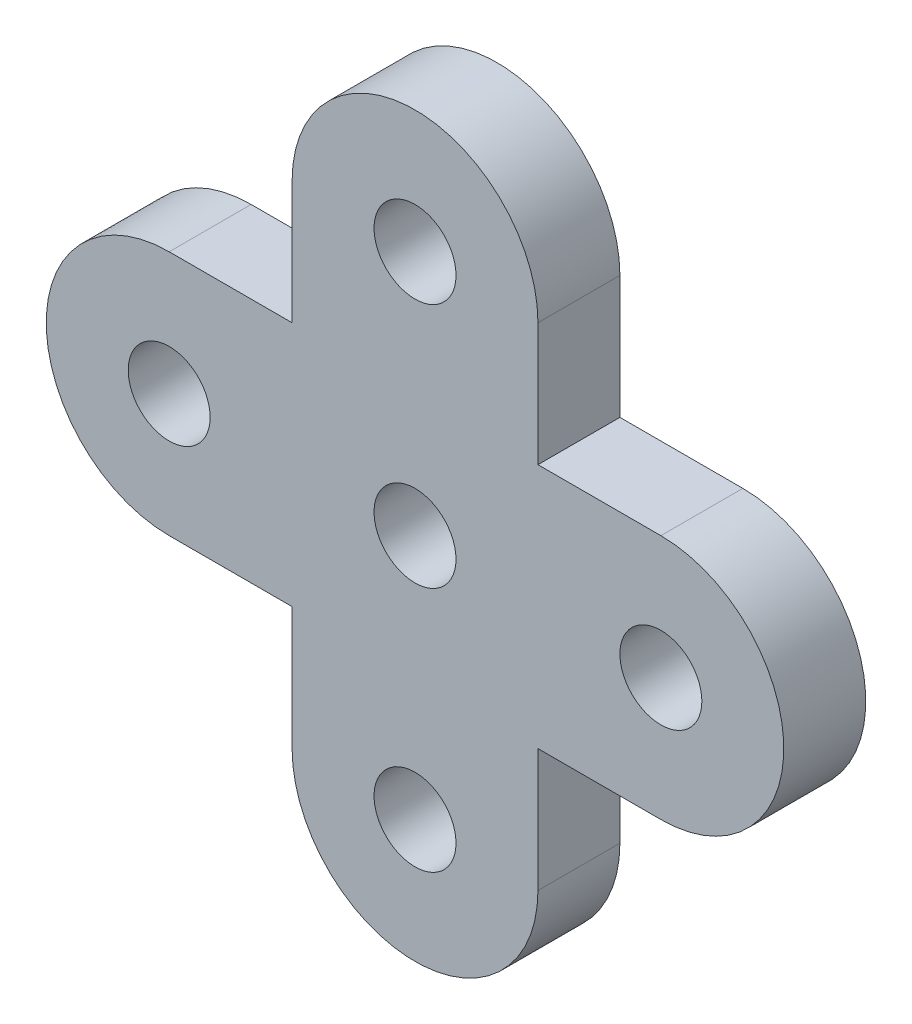
ISO-10303-21;
HEADER;
FILE_DESCRIPTION(('STEP AP214'),'2;1');
FILE_NAME('part.step','',(''),(''),'','','');
FILE_SCHEMA(('AUTOMOTIVE_DESIGN { 1 0 10303 214 1 1 1 1 }'));
ENDSEC;
DATA;
#1=APPLICATION_CONTEXT('core data for automotive mechanical design processes');
#2=APPLICATION_PROTOCOL_DEFINITION('international standard','automotive_design',2000,#1);
#3=PRODUCT_CONTEXT('',#1,'mechanical');
#4=PRODUCT('Part','Part','',(#3));
#5=PRODUCT_RELATED_PRODUCT_CATEGORY('part','',(#4));
#6=PRODUCT_DEFINITION_FORMATION('','',#4);
#7=PRODUCT_DEFINITION_CONTEXT('part definition',#1,'design');
#8=PRODUCT_DEFINITION('design','',#6,#7);
#9=PRODUCT_DEFINITION_SHAPE('','',#8);
#10=(LENGTH_UNIT() NAMED_UNIT(*) SI_UNIT(.MILLI.,.METRE.));
#11=(NAMED_UNIT(*) PLANE_ANGLE_UNIT() SI_UNIT($,.RADIAN.));
#12=(NAMED_UNIT(*) SI_UNIT($,.STERADIAN.) SOLID_ANGLE_UNIT());
#13=UNCERTAINTY_MEASURE_WITH_UNIT(LENGTH_MEASURE(1.E-05),#10,'distance_accuracy_value','');
#14=(GEOMETRIC_REPRESENTATION_CONTEXT(3) GLOBAL_UNCERTAINTY_ASSIGNED_CONTEXT((#13)) GLOBAL_UNIT_ASSIGNED_CONTEXT((#10,
#11,#12)) REPRESENTATION_CONTEXT('',''));
#15=CARTESIAN_POINT('',(0.,0.,0.));
#16=DIRECTION('',(0.,0.,1.));
#17=DIRECTION('',(1.,0.,0.));
#18=AXIS2_PLACEMENT_3D('',#15,#16,#17);
#19=CARTESIAN_POINT('',(208.7507761496,152.428489513,3.));
#20=DIRECTION('',(0.,0.,1.));
#21=DIRECTION('',(1.,0.,0.));
#22=AXIS2_PLACEMENT_3D('',#19,#20,#21);
#23=PLANE('',#22);
#24=CARTESIAN_POINT('',(199.7507761496,161.428489513,3.));
#25=DIRECTION('',(0.,0.,1.));
#26=DIRECTION('',(1.,0.,0.));
#27=AXIS2_PLACEMENT_3D('',#24,#25,#26);
#28=CIRCLE('',#27,1.5);
#29=CARTESIAN_POINT('',(201.2507761496,161.428489513,3.));
#30=VERTEX_POINT('',#29);
#31=EDGE_CURVE('E296',#30,#30,#28,.T.);
#32=ORIENTED_EDGE('',*,*,#31,.F.);
#33=EDGE_LOOP('',(#32));
#34=FACE_BOUND('',#33,.T.);
#35=CARTESIAN_POINT('',(208.7507761496,161.428489513,3.));
#36=DIRECTION('',(0.,0.,1.));
#37=DIRECTION('',(1.,0.,0.));
#38=AXIS2_PLACEMENT_3D('',#35,#36,#37);
#39=CIRCLE('',#38,1.5);
#40=CARTESIAN_POINT('',(210.2507761496,161.428489513,3.));
#41=VERTEX_POINT('',#40);
#42=EDGE_CURVE('E308',#41,#41,#39,.T.);
#43=ORIENTED_EDGE('',*,*,#42,.F.);
#44=EDGE_LOOP('',(#43));
#45=FACE_BOUND('',#44,.T.);
#46=CARTESIAN_POINT('',(208.7507761496,152.428489513,3.));
#47=DIRECTION('',(0.,0.,1.));
#48=DIRECTION('',(1.,0.,0.));
#49=AXIS2_PLACEMENT_3D('',#46,#47,#48);
#50=CIRCLE('',#49,4.5);
#51=CARTESIAN_POINT('',(204.2507761496,152.428489513,3.));
#52=VERTEX_POINT('',#51);
#53=CARTESIAN_POINT('',(213.2507761496,152.428489513,3.));
#54=VERTEX_POINT('',#53);
#55=EDGE_CURVE('E177',#52,#54,#50,.T.);
#56=ORIENTED_EDGE('',*,*,#55,.T.);
#57=DIRECTION('',(0.,1.,0.));
#58=VECTOR('',#57,1.);
#59=CARTESIAN_POINT('',(213.2507761496,152.428489513,3.));
#60=LINE('',#59,#58);
#61=CARTESIAN_POINT('',(213.2507761496,156.928489513,3.));
#62=VERTEX_POINT('',#61);
#63=EDGE_CURVE('E105',#54,#62,#60,.T.);
#64=ORIENTED_EDGE('',*,*,#63,.T.);
#65=DIRECTION('',(1.,0.,0.));
#66=VECTOR('',#65,1.);
#67=CARTESIAN_POINT('',(213.2507761496,156.928489513,3.));
#68=LINE('',#67,#66);
#69=CARTESIAN_POINT('',(217.7507761496,156.928489513,3.));
#70=VERTEX_POINT('',#69);
#71=EDGE_CURVE('E204',#62,#70,#68,.T.);
#72=ORIENTED_EDGE('',*,*,#71,.T.);
#73=CARTESIAN_POINT('',(217.7507761496,161.428489513,3.));
#74=DIRECTION('',(0.,0.,1.));
#75=DIRECTION('',(1.,0.,0.));
#76=AXIS2_PLACEMENT_3D('',#73,#74,#75);
#77=CIRCLE('',#76,4.5);
#78=CARTESIAN_POINT('',(217.7507761496,165.928489513,3.));
#79=VERTEX_POINT('',#78);
#80=EDGE_CURVE('E223',#70,#79,#77,.T.);
#81=ORIENTED_EDGE('',*,*,#80,.T.);
#82=DIRECTION('',(-1.,0.,0.));
#83=VECTOR('',#82,1.);
#84=CARTESIAN_POINT('',(217.7507761496,165.928489513,3.));
#85=LINE('',#84,#83);
#86=CARTESIAN_POINT('',(213.2507761496,165.928489513,3.));
#87=VERTEX_POINT('',#86);
#88=EDGE_CURVE('E220',#79,#87,#85,.T.);
#89=ORIENTED_EDGE('',*,*,#88,.T.);
#90=DIRECTION('',(0.,1.,0.));
#91=VECTOR('',#90,1.);
#92=CARTESIAN_POINT('',(213.2507761496,165.928489513,3.));
#93=LINE('',#92,#91);
#94=CARTESIAN_POINT('',(213.2507761496,170.428489513,3.));
#95=VERTEX_POINT('',#94);
#96=EDGE_CURVE('E222',#87,#95,#93,.T.);
#97=ORIENTED_EDGE('',*,*,#96,.T.);
#98=CARTESIAN_POINT('',(208.7507761496,170.428489513,3.));
#99=DIRECTION('',(0.,0.,1.));
#100=DIRECTION('',(1.,0.,0.));
#101=AXIS2_PLACEMENT_3D('',#98,#99,#100);
#102=CIRCLE('',#101,4.5);
#103=CARTESIAN_POINT('',(204.2507761496,170.428489513,3.));
#104=VERTEX_POINT('',#103);
#105=EDGE_CURVE('E225',#95,#104,#102,.T.);
#106=ORIENTED_EDGE('',*,*,#105,.T.);
#107=DIRECTION('',(0.,-1.,0.));
#108=VECTOR('',#107,1.);
#109=CARTESIAN_POINT('',(204.2507761496,170.428489513,3.));
#110=LINE('',#109,#108);
#111=CARTESIAN_POINT('',(204.2507761496,165.928489513,3.));
#112=VERTEX_POINT('',#111);
#113=EDGE_CURVE('E231',#104,#112,#110,.T.);
#114=ORIENTED_EDGE('',*,*,#113,.T.);
#115=DIRECTION('',(-1.,0.,0.));
#116=VECTOR('',#115,1.);
#117=CARTESIAN_POINT('',(204.2507761496,165.928489513,3.));
#118=LINE('',#117,#116);
#119=CARTESIAN_POINT('',(199.7507761496,165.928489513,3.));
#120=VERTEX_POINT('',#119);
#121=EDGE_CURVE('E136',#112,#120,#118,.T.);
#122=ORIENTED_EDGE('',*,*,#121,.T.);
#123=CARTESIAN_POINT('',(199.7507761496,161.428489513,3.));
#124=DIRECTION('',(0.,0.,1.));
#125=DIRECTION('',(1.,0.,0.));
#126=AXIS2_PLACEMENT_3D('',#123,#124,#125);
#127=CIRCLE('',#126,4.5);
#128=CARTESIAN_POINT('',(199.7507761496,156.928489513,3.));
#129=VERTEX_POINT('',#128);
#130=EDGE_CURVE('E130',#120,#129,#127,.T.);
#131=ORIENTED_EDGE('',*,*,#130,.T.);
#132=DIRECTION('',(1.,0.,0.));
#133=VECTOR('',#132,1.);
#134=CARTESIAN_POINT('',(199.7507761496,156.928489513,3.));
#135=LINE('',#134,#133);
#136=CARTESIAN_POINT('',(204.2507761496,156.928489513,3.));
#137=VERTEX_POINT('',#136);
#138=EDGE_CURVE('E134',#129,#137,#135,.T.);
#139=ORIENTED_EDGE('',*,*,#138,.T.);
#140=DIRECTION('',(0.,-1.,0.));
#141=VECTOR('',#140,1.);
#142=CARTESIAN_POINT('',(204.2507761496,156.928489513,3.));
#143=LINE('',#142,#141);
#144=EDGE_CURVE('E50',#137,#52,#143,.T.);
#145=ORIENTED_EDGE('',*,*,#144,.T.);
#146=EDGE_LOOP('',(#56,#64,#72,#81,#89,#97,#106,#114,#122,#131,#139,#145));
#147=FACE_BOUND('',#146,.T.);
#148=CARTESIAN_POINT('',(208.7507761496,152.428489513,3.));
#149=DIRECTION('',(0.,0.,1.));
#150=DIRECTION('',(1.,0.,0.));
#151=AXIS2_PLACEMENT_3D('',#148,#149,#150);
#152=CIRCLE('',#151,1.5);
#153=CARTESIAN_POINT('',(210.2507761496,152.428489513,3.));
#154=VERTEX_POINT('',#153);
#155=EDGE_CURVE('E158',#154,#154,#152,.T.);
#156=ORIENTED_EDGE('',*,*,#155,.F.);
#157=EDGE_LOOP('',(#156));
#158=FACE_BOUND('',#157,.T.);
#159=CARTESIAN_POINT('',(208.7507761496,170.428489513,3.));
#160=DIRECTION('',(0.,0.,1.));
#161=DIRECTION('',(1.,0.,0.));
#162=AXIS2_PLACEMENT_3D('',#159,#160,#161);
#163=CIRCLE('',#162,1.5);
#164=CARTESIAN_POINT('',(210.2507761496,170.428489513,3.));
#165=VERTEX_POINT('',#164);
#166=EDGE_CURVE('E302',#165,#165,#163,.T.);
#167=ORIENTED_EDGE('',*,*,#166,.F.);
#168=EDGE_LOOP('',(#167));
#169=FACE_BOUND('',#168,.T.);
#170=CARTESIAN_POINT('',(217.7507761496,161.428489513,3.));
#171=DIRECTION('',(0.,0.,1.));
#172=DIRECTION('',(1.,0.,0.));
#173=AXIS2_PLACEMENT_3D('',#170,#171,#172);
#174=CIRCLE('',#173,1.5);
#175=CARTESIAN_POINT('',(219.2507761496,161.428489513,3.));
#176=VERTEX_POINT('',#175);
#177=EDGE_CURVE('E287',#176,#176,#174,.T.);
#178=ORIENTED_EDGE('',*,*,#177,.F.);
#179=EDGE_LOOP('',(#178));
#180=FACE_BOUND('',#179,.T.);
#181=ADVANCED_FACE('F33',(#34,#45,#147,#158,#169,#180),#23,.T.);
#182=CARTESIAN_POINT('',(208.7507761496,152.428489513,0.));
#183=DIRECTION('',(0.,0.,1.));
#184=DIRECTION('',(1.,0.,0.));
#185=AXIS2_PLACEMENT_3D('',#182,#183,#184);
#186=PLANE('',#185);
#187=CARTESIAN_POINT('',(199.7507761496,161.428489513,0.));
#188=DIRECTION('',(0.,0.,1.));
#189=DIRECTION('',(1.,0.,0.));
#190=AXIS2_PLACEMENT_3D('',#187,#188,#189);
#191=CIRCLE('',#190,1.5);
#192=CARTESIAN_POINT('',(201.2507761496,161.428489513,0.));
#193=VERTEX_POINT('',#192);
#194=EDGE_CURVE('E293',#193,#193,#191,.T.);
#195=ORIENTED_EDGE('',*,*,#194,.T.);
#196=EDGE_LOOP('',(#195));
#197=FACE_BOUND('',#196,.T.);
#198=CARTESIAN_POINT('',(208.7507761496,161.428489513,0.));
#199=DIRECTION('',(0.,0.,1.));
#200=DIRECTION('',(1.,0.,0.));
#201=AXIS2_PLACEMENT_3D('',#198,#199,#200);
#202=CIRCLE('',#201,1.5);
#203=CARTESIAN_POINT('',(210.2507761496,161.428489513,0.));
#204=VERTEX_POINT('',#203);
#205=EDGE_CURVE('E305',#204,#204,#202,.T.);
#206=ORIENTED_EDGE('',*,*,#205,.T.);
#207=EDGE_LOOP('',(#206));
#208=FACE_BOUND('',#207,.T.);
#209=CARTESIAN_POINT('',(208.7507761496,152.428489513,0.));
#210=DIRECTION('',(0.,0.,1.));
#211=DIRECTION('',(1.,0.,0.));
#212=AXIS2_PLACEMENT_3D('',#209,#210,#211);
#213=CIRCLE('',#212,4.5);
#214=CARTESIAN_POINT('',(204.2507761496,152.428489513,0.));
#215=VERTEX_POINT('',#214);
#216=CARTESIAN_POINT('',(213.2507761496,152.428489513,0.));
#217=VERTEX_POINT('',#216);
#218=EDGE_CURVE('E154',#215,#217,#213,.T.);
#219=ORIENTED_EDGE('',*,*,#218,.F.);
#220=DIRECTION('',(0.,-1.,0.));
#221=VECTOR('',#220,1.);
#222=CARTESIAN_POINT('',(204.2507761496,156.928489513,0.));
#223=LINE('',#222,#221);
#224=CARTESIAN_POINT('',(204.2507761496,156.928489513,0.));
#225=VERTEX_POINT('',#224);
#226=EDGE_CURVE('E97',#225,#215,#223,.T.);
#227=ORIENTED_EDGE('',*,*,#226,.F.);
#228=DIRECTION('',(1.,0.,0.));
#229=VECTOR('',#228,1.);
#230=CARTESIAN_POINT('',(199.7507761496,156.928489513,0.));
#231=LINE('',#230,#229);
#232=CARTESIAN_POINT('',(199.7507761496,156.928489513,0.));
#233=VERTEX_POINT('',#232);
#234=EDGE_CURVE('E91',#233,#225,#231,.T.);
#235=ORIENTED_EDGE('',*,*,#234,.F.);
#236=CARTESIAN_POINT('',(199.7507761496,161.428489513,0.));
#237=DIRECTION('',(0.,0.,1.));
#238=DIRECTION('',(1.,0.,0.));
#239=AXIS2_PLACEMENT_3D('',#236,#237,#238);
#240=CIRCLE('',#239,4.5);
#241=CARTESIAN_POINT('',(199.7507761496,165.928489513,0.));
#242=VERTEX_POINT('',#241);
#243=EDGE_CURVE('E144',#242,#233,#240,.T.);
#244=ORIENTED_EDGE('',*,*,#243,.F.);
#245=DIRECTION('',(-1.,0.,0.));
#246=VECTOR('',#245,1.);
#247=CARTESIAN_POINT('',(204.2507761496,165.928489513,0.));
#248=LINE('',#247,#246);
#249=CARTESIAN_POINT('',(204.2507761496,165.928489513,0.));
#250=VERTEX_POINT('',#249);
#251=EDGE_CURVE('E172',#250,#242,#248,.T.);
#252=ORIENTED_EDGE('',*,*,#251,.F.);
#253=DIRECTION('',(0.,-1.,0.));
#254=VECTOR('',#253,1.);
#255=CARTESIAN_POINT('',(204.2507761496,170.428489513,0.));
#256=LINE('',#255,#254);
#257=CARTESIAN_POINT('',(204.2507761496,170.428489513,0.));
#258=VERTEX_POINT('',#257);
#259=EDGE_CURVE('E170',#258,#250,#256,.T.);
#260=ORIENTED_EDGE('',*,*,#259,.F.);
#261=CARTESIAN_POINT('',(208.7507761496,170.428489513,0.));
#262=DIRECTION('',(0.,0.,1.));
#263=DIRECTION('',(1.,0.,0.));
#264=AXIS2_PLACEMENT_3D('',#261,#262,#263);
#265=CIRCLE('',#264,4.5);
#266=CARTESIAN_POINT('',(213.2507761496,170.428489513,0.));
#267=VERTEX_POINT('',#266);
#268=EDGE_CURVE('E168',#267,#258,#265,.T.);
#269=ORIENTED_EDGE('',*,*,#268,.F.);
#270=DIRECTION('',(0.,1.,0.));
#271=VECTOR('',#270,1.);
#272=CARTESIAN_POINT('',(213.2507761496,165.928489513,0.));
#273=LINE('',#272,#271);
#274=CARTESIAN_POINT('',(213.2507761496,165.928489513,0.));
#275=VERTEX_POINT('',#274);
#276=EDGE_CURVE('E166',#275,#267,#273,.T.);
#277=ORIENTED_EDGE('',*,*,#276,.F.);
#278=DIRECTION('',(-1.,0.,0.));
#279=VECTOR('',#278,1.);
#280=CARTESIAN_POINT('',(217.7507761496,165.928489513,0.));
#281=LINE('',#280,#279);
#282=CARTESIAN_POINT('',(217.7507761496,165.928489513,0.));
#283=VERTEX_POINT('',#282);
#284=EDGE_CURVE('E164',#283,#275,#281,.T.);
#285=ORIENTED_EDGE('',*,*,#284,.F.);
#286=CARTESIAN_POINT('',(217.7507761496,161.428489513,0.));
#287=DIRECTION('',(0.,0.,1.));
#288=DIRECTION('',(1.,0.,0.));
#289=AXIS2_PLACEMENT_3D('',#286,#287,#288);
#290=CIRCLE('',#289,4.5);
#291=CARTESIAN_POINT('',(217.7507761496,156.928489513,0.));
#292=VERTEX_POINT('',#291);
#293=EDGE_CURVE('E162',#292,#283,#290,.T.);
#294=ORIENTED_EDGE('',*,*,#293,.F.);
#295=DIRECTION('',(1.,0.,0.));
#296=VECTOR('',#295,1.);
#297=CARTESIAN_POINT('',(213.2507761496,156.928489513,0.));
#298=LINE('',#297,#296);
#299=CARTESIAN_POINT('',(213.2507761496,156.928489513,0.));
#300=VERTEX_POINT('',#299);
#301=EDGE_CURVE('E160',#300,#292,#298,.T.);
#302=ORIENTED_EDGE('',*,*,#301,.F.);
#303=DIRECTION('',(0.,1.,0.));
#304=VECTOR('',#303,1.);
#305=CARTESIAN_POINT('',(213.2507761496,152.428489513,0.));
#306=LINE('',#305,#304);
#307=EDGE_CURVE('E157',#217,#300,#306,.T.);
#308=ORIENTED_EDGE('',*,*,#307,.F.);
#309=EDGE_LOOP('',(#219,#227,#235,#244,#252,#260,#269,#277,#285,#294,#302,#308));
#310=FACE_BOUND('',#309,.T.);
#311=CARTESIAN_POINT('',(208.7507761496,152.428489513,0.));
#312=DIRECTION('',(0.,0.,1.));
#313=DIRECTION('',(1.,0.,0.));
#314=AXIS2_PLACEMENT_3D('',#311,#312,#313);
#315=CIRCLE('',#314,1.5);
#316=CARTESIAN_POINT('',(210.2507761496,152.428489513,0.));
#317=VERTEX_POINT('',#316);
#318=EDGE_CURVE('E311',#317,#317,#315,.T.);
#319=ORIENTED_EDGE('',*,*,#318,.T.);
#320=EDGE_LOOP('',(#319));
#321=FACE_BOUND('',#320,.T.);
#322=CARTESIAN_POINT('',(208.7507761496,170.428489513,0.));
#323=DIRECTION('',(0.,0.,1.));
#324=DIRECTION('',(1.,0.,0.));
#325=AXIS2_PLACEMENT_3D('',#322,#323,#324);
#326=CIRCLE('',#325,1.5);
#327=CARTESIAN_POINT('',(210.2507761496,170.428489513,0.));
#328=VERTEX_POINT('',#327);
#329=EDGE_CURVE('E299',#328,#328,#326,.T.);
#330=ORIENTED_EDGE('',*,*,#329,.T.);
#331=EDGE_LOOP('',(#330));
#332=FACE_BOUND('',#331,.T.);
#333=CARTESIAN_POINT('',(217.7507761496,161.428489513,0.));
#334=DIRECTION('',(0.,0.,1.));
#335=DIRECTION('',(1.,0.,0.));
#336=AXIS2_PLACEMENT_3D('',#333,#334,#335);
#337=CIRCLE('',#336,1.5);
#338=CARTESIAN_POINT('',(219.2507761496,161.428489513,0.));
#339=VERTEX_POINT('',#338);
#340=EDGE_CURVE('E290',#339,#339,#337,.T.);
#341=ORIENTED_EDGE('',*,*,#340,.T.);
#342=EDGE_LOOP('',(#341));
#343=FACE_BOUND('',#342,.T.);
#344=ADVANCED_FACE('F208',(#197,#208,#310,#321,#332,#343),#186,.F.);
#345=CARTESIAN_POINT('',(208.7507761496,152.428489513,3.));
#346=DIRECTION('',(0.,0.,-1.));
#347=DIRECTION('',(-1.,0.,0.));
#348=AXIS2_PLACEMENT_3D('',#345,#346,#347);
#349=CYLINDRICAL_SURFACE('',#348,4.5);
#350=ORIENTED_EDGE('',*,*,#218,.T.);
#351=DIRECTION('',(0.,0.,-1.));
#352=VECTOR('',#351,1.);
#353=CARTESIAN_POINT('',(213.2507761496,152.428489513,3.));
#354=LINE('',#353,#352);
#355=EDGE_CURVE('E11',#54,#217,#354,.T.);
#356=ORIENTED_EDGE('',*,*,#355,.F.);
#357=ORIENTED_EDGE('',*,*,#55,.F.);
#358=DIRECTION('',(0.,0.,-1.));
#359=VECTOR('',#358,1.);
#360=CARTESIAN_POINT('',(204.2507761496,152.428489513,3.));
#361=LINE('',#360,#359);
#362=EDGE_CURVE('E150',#52,#215,#361,.T.);
#363=ORIENTED_EDGE('',*,*,#362,.T.);
#364=EDGE_LOOP('',(#350,#356,#357,#363));
#365=FACE_BOUND('',#364,.T.);
#366=ADVANCED_FACE('F35',(#365),#349,.T.);
#367=CARTESIAN_POINT('',(213.2507761496,152.428489513,3.));
#368=DIRECTION('',(-1.,0.,0.));
#369=DIRECTION('',(0.,0.,1.));
#370=AXIS2_PLACEMENT_3D('',#367,#368,#369);
#371=PLANE('',#370);
#372=ORIENTED_EDGE('',*,*,#307,.T.);
#373=DIRECTION('',(0.,0.,-1.));
#374=VECTOR('',#373,1.);
#375=CARTESIAN_POINT('',(213.2507761496,156.928489513,3.));
#376=LINE('',#375,#374);
#377=EDGE_CURVE('E42',#62,#300,#376,.T.);
#378=ORIENTED_EDGE('',*,*,#377,.F.);
#379=ORIENTED_EDGE('',*,*,#63,.F.);
#380=ORIENTED_EDGE('',*,*,#355,.T.);
#381=EDGE_LOOP('',(#372,#378,#379,#380));
#382=FACE_BOUND('',#381,.T.);
#383=ADVANCED_FACE('F429',(#382),#371,.F.);
#384=CARTESIAN_POINT('',(213.2507761496,156.928489513,3.));
#385=DIRECTION('',(0.,1.,0.));
#386=DIRECTION('',(0.,0.,1.));
#387=AXIS2_PLACEMENT_3D('',#384,#385,#386);
#388=PLANE('',#387);
#389=ORIENTED_EDGE('',*,*,#301,.T.);
#390=DIRECTION('',(0.,0.,-1.));
#391=VECTOR('',#390,1.);
#392=CARTESIAN_POINT('',(217.7507761496,156.928489513,3.));
#393=LINE('',#392,#391);
#394=EDGE_CURVE('E196',#70,#292,#393,.T.);
#395=ORIENTED_EDGE('',*,*,#394,.F.);
#396=ORIENTED_EDGE('',*,*,#71,.F.);
#397=ORIENTED_EDGE('',*,*,#377,.T.);
#398=EDGE_LOOP('',(#389,#395,#396,#397));
#399=FACE_BOUND('',#398,.T.);
#400=ADVANCED_FACE('F202',(#399),#388,.F.);
#401=CARTESIAN_POINT('',(217.7507761496,161.428489513,3.));
#402=DIRECTION('',(0.,0.,-1.));
#403=DIRECTION('',(-1.,0.,0.));
#404=AXIS2_PLACEMENT_3D('',#401,#402,#403);
#405=CYLINDRICAL_SURFACE('',#404,4.5);
#406=ORIENTED_EDGE('',*,*,#293,.T.);
#407=DIRECTION('',(0.,0.,-1.));
#408=VECTOR('',#407,1.);
#409=CARTESIAN_POINT('',(217.7507761496,165.928489513,3.));
#410=LINE('',#409,#408);
#411=EDGE_CURVE('E193',#79,#283,#410,.T.);
#412=ORIENTED_EDGE('',*,*,#411,.F.);
#413=ORIENTED_EDGE('',*,*,#80,.F.);
#414=ORIENTED_EDGE('',*,*,#394,.T.);
#415=EDGE_LOOP('',(#406,#412,#413,#414));
#416=FACE_BOUND('',#415,.T.);
#417=ADVANCED_FACE('F214',(#416),#405,.T.);
#418=CARTESIAN_POINT('',(217.7507761496,165.928489513,3.));
#419=DIRECTION('',(0.,-1.,0.));
#420=DIRECTION('',(0.,0.,-1.));
#421=AXIS2_PLACEMENT_3D('',#418,#419,#420);
#422=PLANE('',#421);
#423=ORIENTED_EDGE('',*,*,#284,.T.);
#424=DIRECTION('',(0.,0.,-1.));
#425=VECTOR('',#424,1.);
#426=CARTESIAN_POINT('',(213.2507761496,165.928489513,3.));
#427=LINE('',#426,#425);
#428=EDGE_CURVE('E190',#87,#275,#427,.T.);
#429=ORIENTED_EDGE('',*,*,#428,.F.);
#430=ORIENTED_EDGE('',*,*,#88,.F.);
#431=ORIENTED_EDGE('',*,*,#411,.T.);
#432=EDGE_LOOP('',(#423,#429,#430,#431));
#433=FACE_BOUND('',#432,.T.);
#434=ADVANCED_FACE('F218',(#433),#422,.F.);
#435=CARTESIAN_POINT('',(213.2507761496,165.928489513,3.));
#436=DIRECTION('',(-1.,0.,0.));
#437=DIRECTION('',(0.,0.,1.));
#438=AXIS2_PLACEMENT_3D('',#435,#436,#437);
#439=PLANE('',#438);
#440=ORIENTED_EDGE('',*,*,#276,.T.);
#441=DIRECTION('',(0.,0.,-1.));
#442=VECTOR('',#441,1.);
#443=CARTESIAN_POINT('',(213.2507761496,170.428489513,3.));
#444=LINE('',#443,#442);
#445=EDGE_CURVE('E187',#95,#267,#444,.T.);
#446=ORIENTED_EDGE('',*,*,#445,.F.);
#447=ORIENTED_EDGE('',*,*,#96,.F.);
#448=ORIENTED_EDGE('',*,*,#428,.T.);
#449=EDGE_LOOP('',(#440,#446,#447,#448));
#450=FACE_BOUND('',#449,.T.);
#451=ADVANCED_FACE('F394',(#450),#439,.F.);
#452=CARTESIAN_POINT('',(208.7507761496,170.428489513,3.));
#453=DIRECTION('',(0.,0.,-1.));
#454=DIRECTION('',(-1.,0.,0.));
#455=AXIS2_PLACEMENT_3D('',#452,#453,#454);
#456=CYLINDRICAL_SURFACE('',#455,4.5);
#457=ORIENTED_EDGE('',*,*,#268,.T.);
#458=DIRECTION('',(0.,0.,-1.));
#459=VECTOR('',#458,1.);
#460=CARTESIAN_POINT('',(204.2507761496,170.428489513,3.));
#461=LINE('',#460,#459);
#462=EDGE_CURVE('E184',#104,#258,#461,.T.);
#463=ORIENTED_EDGE('',*,*,#462,.F.);
#464=ORIENTED_EDGE('',*,*,#105,.F.);
#465=ORIENTED_EDGE('',*,*,#445,.T.);
#466=EDGE_LOOP('',(#457,#463,#464,#465));
#467=FACE_BOUND('',#466,.T.);
#468=ADVANCED_FACE('F385',(#467),#456,.T.);
#469=CARTESIAN_POINT('',(204.2507761496,170.428489513,3.));
#470=DIRECTION('',(1.,0.,0.));
#471=DIRECTION('',(0.,0.,-1.));
#472=AXIS2_PLACEMENT_3D('',#469,#470,#471);
#473=PLANE('',#472);
#474=ORIENTED_EDGE('',*,*,#259,.T.);
#475=DIRECTION('',(0.,0.,-1.));
#476=VECTOR('',#475,1.);
#477=CARTESIAN_POINT('',(204.2507761496,165.928489513,3.));
#478=LINE('',#477,#476);
#479=EDGE_CURVE('E181',#112,#250,#478,.T.);
#480=ORIENTED_EDGE('',*,*,#479,.F.);
#481=ORIENTED_EDGE('',*,*,#113,.F.);
#482=ORIENTED_EDGE('',*,*,#462,.T.);
#483=EDGE_LOOP('',(#474,#480,#481,#482));
#484=FACE_BOUND('',#483,.T.);
#485=ADVANCED_FACE('F237',(#484),#473,.F.);
#486=CARTESIAN_POINT('',(204.2507761496,165.928489513,3.));
#487=DIRECTION('',(0.,-1.,0.));
#488=DIRECTION('',(0.,0.,-1.));
#489=AXIS2_PLACEMENT_3D('',#486,#487,#488);
#490=PLANE('',#489);
#491=ORIENTED_EDGE('',*,*,#251,.T.);
#492=DIRECTION('',(0.,0.,-1.));
#493=VECTOR('',#492,1.);
#494=CARTESIAN_POINT('',(199.7507761496,165.928489513,3.));
#495=LINE('',#494,#493);
#496=EDGE_CURVE('E145',#120,#242,#495,.T.);
#497=ORIENTED_EDGE('',*,*,#496,.F.);
#498=ORIENTED_EDGE('',*,*,#121,.F.);
#499=ORIENTED_EDGE('',*,*,#479,.T.);
#500=EDGE_LOOP('',(#491,#497,#498,#499));
#501=FACE_BOUND('',#500,.T.);
#502=ADVANCED_FACE('F241',(#501),#490,.F.);
#503=CARTESIAN_POINT('',(199.7507761496,161.428489513,3.));
#504=DIRECTION('',(0.,0.,-1.));
#505=DIRECTION('',(-1.,0.,0.));
#506=AXIS2_PLACEMENT_3D('',#503,#504,#505);
#507=CYLINDRICAL_SURFACE('',#506,4.5);
#508=ORIENTED_EDGE('',*,*,#243,.T.);
#509=DIRECTION('',(0.,0.,-1.));
#510=VECTOR('',#509,1.);
#511=CARTESIAN_POINT('',(199.7507761496,156.928489513,3.));
#512=LINE('',#511,#510);
#513=EDGE_CURVE('E141',#129,#233,#512,.T.);
#514=ORIENTED_EDGE('',*,*,#513,.F.);
#515=ORIENTED_EDGE('',*,*,#130,.F.);
#516=ORIENTED_EDGE('',*,*,#496,.T.);
#517=EDGE_LOOP('',(#508,#514,#515,#516));
#518=FACE_BOUND('',#517,.T.);
#519=ADVANCED_FACE('F142',(#518),#507,.T.);
#520=CARTESIAN_POINT('',(199.7507761496,156.928489513,3.));
#521=DIRECTION('',(0.,1.,0.));
#522=DIRECTION('',(0.,0.,1.));
#523=AXIS2_PLACEMENT_3D('',#520,#521,#522);
#524=PLANE('',#523);
#525=ORIENTED_EDGE('',*,*,#234,.T.);
#526=DIRECTION('',(0.,0.,-1.));
#527=VECTOR('',#526,1.);
#528=CARTESIAN_POINT('',(204.2507761496,156.928489513,3.));
#529=LINE('',#528,#527);
#530=EDGE_CURVE('E146',#137,#225,#529,.T.);
#531=ORIENTED_EDGE('',*,*,#530,.F.);
#532=ORIENTED_EDGE('',*,*,#138,.F.);
#533=ORIENTED_EDGE('',*,*,#513,.T.);
#534=EDGE_LOOP('',(#525,#531,#532,#533));
#535=FACE_BOUND('',#534,.T.);
#536=ADVANCED_FACE('F148',(#535),#524,.F.);
#537=CARTESIAN_POINT('',(204.2507761496,156.928489513,3.));
#538=DIRECTION('',(1.,0.,0.));
#539=DIRECTION('',(0.,0.,-1.));
#540=AXIS2_PLACEMENT_3D('',#537,#538,#539);
#541=PLANE('',#540);
#542=ORIENTED_EDGE('',*,*,#226,.T.);
#543=ORIENTED_EDGE('',*,*,#362,.F.);
#544=ORIENTED_EDGE('',*,*,#144,.F.);
#545=ORIENTED_EDGE('',*,*,#530,.T.);
#546=EDGE_LOOP('',(#542,#543,#544,#545));
#547=FACE_BOUND('',#546,.T.);
#548=ADVANCED_FACE('F245',(#547),#541,.F.);
#549=CARTESIAN_POINT('',(208.7507761496,152.428489513,3.));
#550=DIRECTION('',(0.,0.,-1.));
#551=DIRECTION('',(-1.,0.,0.));
#552=AXIS2_PLACEMENT_3D('',#549,#550,#551);
#553=CYLINDRICAL_SURFACE('',#552,1.5);
#554=ORIENTED_EDGE('',*,*,#155,.T.);
#555=EDGE_LOOP('',(#554));
#556=FACE_BOUND('',#555,.T.);
#557=ORIENTED_EDGE('',*,*,#318,.F.);
#558=EDGE_LOOP('',(#557));
#559=FACE_BOUND('',#558,.T.);
#560=ADVANCED_FACE('F247',(#556,#559),#553,.F.);
#561=CARTESIAN_POINT('',(208.7507761496,161.428489513,3.));
#562=DIRECTION('',(0.,0.,-1.));
#563=DIRECTION('',(-1.,0.,0.));
#564=AXIS2_PLACEMENT_3D('',#561,#562,#563);
#565=CYLINDRICAL_SURFACE('',#564,1.5);
#566=ORIENTED_EDGE('',*,*,#42,.T.);
#567=EDGE_LOOP('',(#566));
#568=FACE_BOUND('',#567,.T.);
#569=ORIENTED_EDGE('',*,*,#205,.F.);
#570=EDGE_LOOP('',(#569));
#571=FACE_BOUND('',#570,.T.);
#572=ADVANCED_FACE('F253',(#568,#571),#565,.F.);
#573=CARTESIAN_POINT('',(208.7507761496,170.428489513,3.));
#574=DIRECTION('',(0.,0.,-1.));
#575=DIRECTION('',(-1.,0.,0.));
#576=AXIS2_PLACEMENT_3D('',#573,#574,#575);
#577=CYLINDRICAL_SURFACE('',#576,1.5);
#578=ORIENTED_EDGE('',*,*,#166,.T.);
#579=EDGE_LOOP('',(#578));
#580=FACE_BOUND('',#579,.T.);
#581=ORIENTED_EDGE('',*,*,#329,.F.);
#582=EDGE_LOOP('',(#581));
#583=FACE_BOUND('',#582,.T.);
#584=ADVANCED_FACE('F270',(#580,#583),#577,.F.);
#585=CARTESIAN_POINT('',(199.7507761496,161.428489513,3.));
#586=DIRECTION('',(0.,0.,-1.));
#587=DIRECTION('',(-1.,0.,0.));
#588=AXIS2_PLACEMENT_3D('',#585,#586,#587);
#589=CYLINDRICAL_SURFACE('',#588,1.5);
#590=ORIENTED_EDGE('',*,*,#31,.T.);
#591=EDGE_LOOP('',(#590));
#592=FACE_BOUND('',#591,.T.);
#593=ORIENTED_EDGE('',*,*,#194,.F.);
#594=EDGE_LOOP('',(#593));
#595=FACE_BOUND('',#594,.T.);
#596=ADVANCED_FACE('F274',(#592,#595),#589,.F.);
#597=CARTESIAN_POINT('',(217.7507761496,161.428489513,3.));
#598=DIRECTION('',(0.,0.,-1.));
#599=DIRECTION('',(-1.,0.,0.));
#600=AXIS2_PLACEMENT_3D('',#597,#598,#599);
#601=CYLINDRICAL_SURFACE('',#600,1.5);
#602=ORIENTED_EDGE('',*,*,#177,.T.);
#603=EDGE_LOOP('',(#602));
#604=FACE_BOUND('',#603,.T.);
#605=ORIENTED_EDGE('',*,*,#340,.F.);
#606=EDGE_LOOP('',(#605));
#607=FACE_BOUND('',#606,.T.);
#608=ADVANCED_FACE('F278',(#604,#607),#601,.F.);
#609=CLOSED_SHELL('',(#181,#344,#366,#383,#400,#417,#434,#451,#468,#485,#502,#519,#536,#548,
#560,#572,#584,#596,#608));
#610=MANIFOLD_SOLID_BREP('B2',#609);
#611=ADVANCED_BREP_SHAPE_REPRESENTATION('',(#18,#610),#14);
#612=SHAPE_DEFINITION_REPRESENTATION(#9,#611);
ENDSEC;
END-ISO-10303-21;
